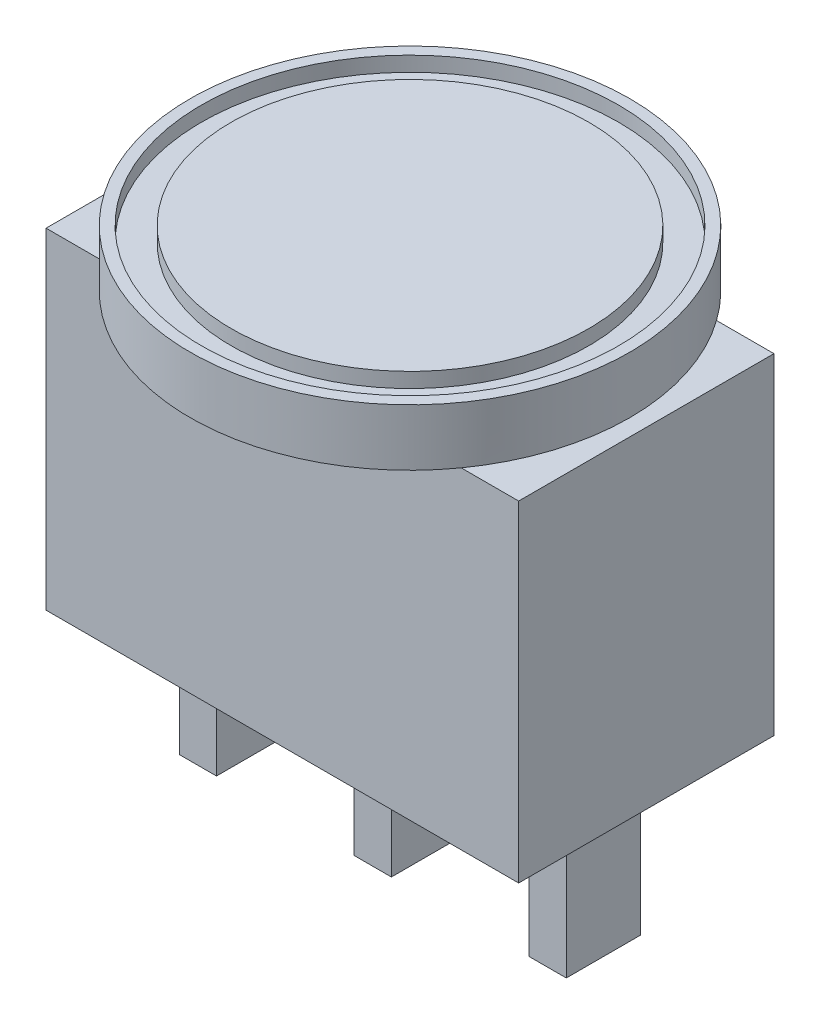
ISO-10303-21;
HEADER;
FILE_DESCRIPTION(('STEP AP214'),'2;1');
FILE_NAME('part.step','',(''),(''),'','','');
FILE_SCHEMA(('AUTOMOTIVE_DESIGN { 1 0 10303 214 1 1 1 1 }'));
ENDSEC;
DATA;
#1=APPLICATION_CONTEXT('core data for automotive mechanical design processes');
#2=APPLICATION_PROTOCOL_DEFINITION('international standard','automotive_design',2000,#1);
#3=PRODUCT_CONTEXT('',#1,'mechanical');
#4=PRODUCT('Part','Part','',(#3));
#5=PRODUCT_RELATED_PRODUCT_CATEGORY('part','',(#4));
#6=PRODUCT_DEFINITION_FORMATION('','',#4);
#7=PRODUCT_DEFINITION_CONTEXT('part definition',#1,'design');
#8=PRODUCT_DEFINITION('design','',#6,#7);
#9=PRODUCT_DEFINITION_SHAPE('','',#8);
#10=(LENGTH_UNIT() NAMED_UNIT(*) SI_UNIT(.MILLI.,.METRE.));
#11=(NAMED_UNIT(*) PLANE_ANGLE_UNIT() SI_UNIT($,.RADIAN.));
#12=(NAMED_UNIT(*) SI_UNIT($,.STERADIAN.) SOLID_ANGLE_UNIT());
#13=UNCERTAINTY_MEASURE_WITH_UNIT(LENGTH_MEASURE(1.E-05),#10,'distance_accuracy_value','');
#14=(GEOMETRIC_REPRESENTATION_CONTEXT(3) GLOBAL_UNCERTAINTY_ASSIGNED_CONTEXT((#13)) GLOBAL_UNIT_ASSIGNED_CONTEXT((#10,
#11,#12)) REPRESENTATION_CONTEXT('',''));
#15=CARTESIAN_POINT('',(0.,0.,0.));
#16=DIRECTION('',(0.,0.,1.));
#17=DIRECTION('',(1.,0.,0.));
#18=AXIS2_PLACEMENT_3D('',#15,#16,#17);
#19=CARTESIAN_POINT('',(-6.35,0.,-3.43));
#20=DIRECTION('',(0.,1.,0.));
#21=DIRECTION('',(-1.,0.,0.));
#22=AXIS2_PLACEMENT_3D('',#19,#20,#21);
#23=PLANE('',#22);
#24=DIRECTION('',(-1.,0.,0.));
#25=VECTOR('',#24,1.);
#26=CARTESIAN_POINT('',(-6.35,0.,-3.43));
#27=LINE('',#26,#25);
#28=CARTESIAN_POINT('',(6.35,0.,-3.43));
#29=VERTEX_POINT('',#28);
#30=CARTESIAN_POINT('',(4.80667504622478,0.,-3.43));
#31=VERTEX_POINT('',#30);
#32=EDGE_CURVE('E186',#29,#31,#27,.T.);
#33=ORIENTED_EDGE('',*,*,#32,.T.);
#34=CARTESIAN_POINT('',(0.,0.,0.));
#35=DIRECTION('',(0.,-1.,0.));
#36=DIRECTION('',(0.,0.,-1.));
#37=AXIS2_PLACEMENT_3D('',#34,#35,#36);
#38=CIRCLE('',#37,5.905);
#39=CARTESIAN_POINT('',(4.80667504622478,0.,3.43));
#40=VERTEX_POINT('',#39);
#41=EDGE_CURVE('E50',#31,#40,#38,.T.);
#42=ORIENTED_EDGE('',*,*,#41,.T.);
#43=DIRECTION('',(-1.,0.,0.));
#44=VECTOR('',#43,1.);
#45=CARTESIAN_POINT('',(-6.35,0.,3.43));
#46=LINE('',#45,#44);
#47=CARTESIAN_POINT('',(6.35,0.,3.43));
#48=VERTEX_POINT('',#47);
#49=EDGE_CURVE('E206',#48,#40,#46,.T.);
#50=ORIENTED_EDGE('',*,*,#49,.F.);
#51=DIRECTION('',(0.,0.,1.));
#52=VECTOR('',#51,1.);
#53=CARTESIAN_POINT('',(6.35,0.,-3.43));
#54=LINE('',#53,#52);
#55=EDGE_CURVE('E189',#29,#48,#54,.T.);
#56=ORIENTED_EDGE('',*,*,#55,.F.);
#57=EDGE_LOOP('',(#33,#42,#50,#56));
#58=FACE_BOUND('',#57,.T.);
#59=ADVANCED_FACE('F39',(#58),#23,.T.);
#60=CARTESIAN_POINT('',(-6.35,-8.89,-3.43));
#61=DIRECTION('',(0.,-1.,0.));
#62=DIRECTION('',(1.,0.,0.));
#63=AXIS2_PLACEMENT_3D('',#60,#61,#62);
#64=PLANE('',#63);
#65=DIRECTION('',(-1.,0.,0.));
#66=VECTOR('',#65,1.);
#67=CARTESIAN_POINT('',(4.2,-8.89,-1.));
#68=LINE('',#67,#66);
#69=CARTESIAN_POINT('',(5.2,-8.89,-1.));
#70=VERTEX_POINT('',#69);
#71=CARTESIAN_POINT('',(4.2,-8.89,-1.));
#72=VERTEX_POINT('',#71);
#73=EDGE_CURVE('E302',#70,#72,#68,.T.);
#74=ORIENTED_EDGE('',*,*,#73,.T.);
#75=DIRECTION('',(0.,0.,1.));
#76=VECTOR('',#75,1.);
#77=CARTESIAN_POINT('',(4.2,-8.89,-1.));
#78=LINE('',#77,#76);
#79=CARTESIAN_POINT('',(4.2,-8.89,1.));
#80=VERTEX_POINT('',#79);
#81=EDGE_CURVE('E285',#72,#80,#78,.T.);
#82=ORIENTED_EDGE('',*,*,#81,.T.);
#83=DIRECTION('',(-1.,0.,0.));
#84=VECTOR('',#83,1.);
#85=CARTESIAN_POINT('',(4.2,-8.89,1.));
#86=LINE('',#85,#84);
#87=CARTESIAN_POINT('',(5.2,-8.89,1.));
#88=VERTEX_POINT('',#87);
#89=EDGE_CURVE('E311',#88,#80,#86,.T.);
#90=ORIENTED_EDGE('',*,*,#89,.F.);
#91=DIRECTION('',(0.,0.,1.));
#92=VECTOR('',#91,1.);
#93=CARTESIAN_POINT('',(5.2,-8.89,-1.));
#94=LINE('',#93,#92);
#95=EDGE_CURVE('E284',#70,#88,#94,.T.);
#96=ORIENTED_EDGE('',*,*,#95,.F.);
#97=EDGE_LOOP('',(#74,#82,#90,#96));
#98=FACE_BOUND('',#97,.T.);
#99=DIRECTION('',(-1.,0.,0.));
#100=VECTOR('',#99,1.);
#101=CARTESIAN_POINT('',(-0.5,-8.89,-1.));
#102=LINE('',#101,#100);
#103=CARTESIAN_POINT('',(0.5,-8.89,-1.));
#104=VERTEX_POINT('',#103);
#105=CARTESIAN_POINT('',(-0.5,-8.89,-1.));
#106=VERTEX_POINT('',#105);
#107=EDGE_CURVE('E270',#104,#106,#102,.T.);
#108=ORIENTED_EDGE('',*,*,#107,.T.);
#109=DIRECTION('',(0.,0.,1.));
#110=VECTOR('',#109,1.);
#111=CARTESIAN_POINT('',(-0.5,-8.89,-1.));
#112=LINE('',#111,#110);
#113=CARTESIAN_POINT('',(-0.5,-8.89,1.));
#114=VERTEX_POINT('',#113);
#115=EDGE_CURVE('E252',#106,#114,#112,.T.);
#116=ORIENTED_EDGE('',*,*,#115,.T.);
#117=DIRECTION('',(-1.,0.,0.));
#118=VECTOR('',#117,1.);
#119=CARTESIAN_POINT('',(-0.5,-8.89,1.));
#120=LINE('',#119,#118);
#121=CARTESIAN_POINT('',(0.5,-8.89,1.));
#122=VERTEX_POINT('',#121);
#123=EDGE_CURVE('E281',#122,#114,#120,.T.);
#124=ORIENTED_EDGE('',*,*,#123,.F.);
#125=DIRECTION('',(0.,0.,1.));
#126=VECTOR('',#125,1.);
#127=CARTESIAN_POINT('',(0.5,-8.89,-1.));
#128=LINE('',#127,#126);
#129=EDGE_CURVE('E251',#104,#122,#128,.T.);
#130=ORIENTED_EDGE('',*,*,#129,.F.);
#131=EDGE_LOOP('',(#108,#116,#124,#130));
#132=FACE_BOUND('',#131,.T.);
#133=DIRECTION('',(0.,0.,1.));
#134=VECTOR('',#133,1.);
#135=CARTESIAN_POINT('',(6.35,-8.89,-3.43));
#136=LINE('',#135,#134);
#137=CARTESIAN_POINT('',(6.35,-8.89,-3.43));
#138=VERTEX_POINT('',#137);
#139=CARTESIAN_POINT('',(6.35,-8.89,3.43));
#140=VERTEX_POINT('',#139);
#141=EDGE_CURVE('E191',#138,#140,#136,.T.);
#142=ORIENTED_EDGE('',*,*,#141,.T.);
#143=DIRECTION('',(1.,0.,0.));
#144=VECTOR('',#143,1.);
#145=CARTESIAN_POINT('',(-6.35,-8.89,3.43));
#146=LINE('',#145,#144);
#147=CARTESIAN_POINT('',(-6.35,-8.89,3.43));
#148=VERTEX_POINT('',#147);
#149=EDGE_CURVE('E213',#148,#140,#146,.T.);
#150=ORIENTED_EDGE('',*,*,#149,.F.);
#151=DIRECTION('',(0.,0.,1.));
#152=VECTOR('',#151,1.);
#153=CARTESIAN_POINT('',(-6.35,-8.89,-3.43));
#154=LINE('',#153,#152);
#155=CARTESIAN_POINT('',(-6.35,-8.89,-3.43));
#156=VERTEX_POINT('',#155);
#157=EDGE_CURVE('E43',#156,#148,#154,.T.);
#158=ORIENTED_EDGE('',*,*,#157,.F.);
#159=DIRECTION('',(1.,0.,0.));
#160=VECTOR('',#159,1.);
#161=CARTESIAN_POINT('',(-6.35,-8.89,-3.43));
#162=LINE('',#161,#160);
#163=EDGE_CURVE('E198',#156,#138,#162,.T.);
#164=ORIENTED_EDGE('',*,*,#163,.T.);
#165=EDGE_LOOP('',(#142,#150,#158,#164));
#166=FACE_BOUND('',#165,.T.);
#167=DIRECTION('',(0.,0.,1.));
#168=VECTOR('',#167,1.);
#169=CARTESIAN_POINT('',(-4.2,-8.89,-1.));
#170=LINE('',#169,#168);
#171=CARTESIAN_POINT('',(-4.2,-8.89,-1.));
#172=VERTEX_POINT('',#171);
#173=CARTESIAN_POINT('',(-4.2,-8.89,1.));
#174=VERTEX_POINT('',#173);
#175=EDGE_CURVE('E225',#172,#174,#170,.T.);
#176=ORIENTED_EDGE('',*,*,#175,.F.);
#177=DIRECTION('',(-1.,0.,0.));
#178=VECTOR('',#177,1.);
#179=CARTESIAN_POINT('',(-5.2,-8.89,-1.));
#180=LINE('',#179,#178);
#181=CARTESIAN_POINT('',(-5.2,-8.89,-1.));
#182=VERTEX_POINT('',#181);
#183=EDGE_CURVE('E223',#172,#182,#180,.T.);
#184=ORIENTED_EDGE('',*,*,#183,.T.);
#185=DIRECTION('',(0.,0.,1.));
#186=VECTOR('',#185,1.);
#187=CARTESIAN_POINT('',(-5.2,-8.89,-1.));
#188=LINE('',#187,#186);
#189=CARTESIAN_POINT('',(-5.2,-8.89,1.));
#190=VERTEX_POINT('',#189);
#191=EDGE_CURVE('E219',#182,#190,#188,.T.);
#192=ORIENTED_EDGE('',*,*,#191,.T.);
#193=DIRECTION('',(-1.,0.,0.));
#194=VECTOR('',#193,1.);
#195=CARTESIAN_POINT('',(-5.2,-8.89,1.));
#196=LINE('',#195,#194);
#197=EDGE_CURVE('E239',#174,#190,#196,.T.);
#198=ORIENTED_EDGE('',*,*,#197,.F.);
#199=EDGE_LOOP('',(#176,#184,#192,#198));
#200=FACE_BOUND('',#199,.T.);
#201=ADVANCED_FACE('F343',(#98,#132,#166,#200),#64,.T.);
#202=CARTESIAN_POINT('',(-6.35,-8.89,-3.43));
#203=DIRECTION('',(-1.,0.,0.));
#204=DIRECTION('',(0.,-1.,0.));
#205=AXIS2_PLACEMENT_3D('',#202,#203,#204);
#206=PLANE('',#205);
#207=ORIENTED_EDGE('',*,*,#157,.T.);
#208=DIRECTION('',(0.,-1.,0.));
#209=VECTOR('',#208,1.);
#210=CARTESIAN_POINT('',(-6.35,-8.89,3.43));
#211=LINE('',#210,#209);
#212=CARTESIAN_POINT('',(-6.35,0.,3.43));
#213=VERTEX_POINT('',#212);
#214=EDGE_CURVE('E216',#213,#148,#211,.T.);
#215=ORIENTED_EDGE('',*,*,#214,.F.);
#216=DIRECTION('',(0.,0.,1.));
#217=VECTOR('',#216,1.);
#218=CARTESIAN_POINT('',(-6.35,0.,-3.43));
#219=LINE('',#218,#217);
#220=CARTESIAN_POINT('',(-6.35,0.,-3.43));
#221=VERTEX_POINT('',#220);
#222=EDGE_CURVE('E48',#221,#213,#219,.T.);
#223=ORIENTED_EDGE('',*,*,#222,.F.);
#224=DIRECTION('',(0.,-1.,0.));
#225=VECTOR('',#224,1.);
#226=CARTESIAN_POINT('',(-6.35,-8.89,-3.43));
#227=LINE('',#226,#225);
#228=EDGE_CURVE('E201',#221,#156,#227,.T.);
#229=ORIENTED_EDGE('',*,*,#228,.T.);
#230=EDGE_LOOP('',(#207,#215,#223,#229));
#231=FACE_BOUND('',#230,.T.);
#232=ADVANCED_FACE('F41',(#231),#206,.T.);
#233=CARTESIAN_POINT('',(-4.80667504622478,0.,3.43));
#234=VERTEX_POINT('',#233);
#235=EDGE_CURVE('E209',#234,#213,#46,.T.);
#236=ORIENTED_EDGE('',*,*,#235,.F.);
#237=CARTESIAN_POINT('',(-4.80667504622478,0.,-3.43));
#238=VERTEX_POINT('',#237);
#239=EDGE_CURVE('E11',#234,#238,#38,.T.);
#240=ORIENTED_EDGE('',*,*,#239,.T.);
#241=EDGE_CURVE('E187',#238,#221,#27,.T.);
#242=ORIENTED_EDGE('',*,*,#241,.T.);
#243=ORIENTED_EDGE('',*,*,#222,.T.);
#244=EDGE_LOOP('',(#236,#240,#242,#243));
#245=FACE_BOUND('',#244,.T.);
#246=ADVANCED_FACE('F345',(#245),#23,.T.);
#247=CARTESIAN_POINT('',(6.35,-8.89,-3.43));
#248=DIRECTION('',(1.,0.,0.));
#249=DIRECTION('',(0.,1.,0.));
#250=AXIS2_PLACEMENT_3D('',#247,#248,#249);
#251=PLANE('',#250);
#252=ORIENTED_EDGE('',*,*,#55,.T.);
#253=DIRECTION('',(0.,1.,0.));
#254=VECTOR('',#253,1.);
#255=CARTESIAN_POINT('',(6.35,-8.89,3.43));
#256=LINE('',#255,#254);
#257=EDGE_CURVE('E210',#140,#48,#256,.T.);
#258=ORIENTED_EDGE('',*,*,#257,.F.);
#259=ORIENTED_EDGE('',*,*,#141,.F.);
#260=DIRECTION('',(0.,1.,0.));
#261=VECTOR('',#260,1.);
#262=CARTESIAN_POINT('',(6.35,-8.89,-3.43));
#263=LINE('',#262,#261);
#264=EDGE_CURVE('E194',#138,#29,#263,.T.);
#265=ORIENTED_EDGE('',*,*,#264,.T.);
#266=EDGE_LOOP('',(#252,#258,#259,#265));
#267=FACE_BOUND('',#266,.T.);
#268=ADVANCED_FACE('F353',(#267),#251,.T.);
#269=CARTESIAN_POINT('',(0.,0.,-3.43));
#270=DIRECTION('',(0.,0.,-1.));
#271=DIRECTION('',(-1.,0.,0.));
#272=AXIS2_PLACEMENT_3D('',#269,#270,#271);
#273=PLANE('',#272);
#274=ORIENTED_EDGE('',*,*,#228,.F.);
#275=ORIENTED_EDGE('',*,*,#241,.F.);
#276=EDGE_CURVE('E170',#31,#238,#27,.T.);
#277=ORIENTED_EDGE('',*,*,#276,.F.);
#278=ORIENTED_EDGE('',*,*,#32,.F.);
#279=ORIENTED_EDGE('',*,*,#264,.F.);
#280=ORIENTED_EDGE('',*,*,#163,.F.);
#281=EDGE_LOOP('',(#274,#275,#277,#278,#279,#280));
#282=FACE_BOUND('',#281,.T.);
#283=ADVANCED_FACE('F184',(#282),#273,.T.);
#284=CARTESIAN_POINT('',(0.,0.,3.43));
#285=DIRECTION('',(0.,0.,-1.));
#286=DIRECTION('',(-1.,0.,0.));
#287=AXIS2_PLACEMENT_3D('',#284,#285,#286);
#288=PLANE('',#287);
#289=ORIENTED_EDGE('',*,*,#214,.T.);
#290=ORIENTED_EDGE('',*,*,#149,.T.);
#291=ORIENTED_EDGE('',*,*,#257,.T.);
#292=ORIENTED_EDGE('',*,*,#49,.T.);
#293=EDGE_CURVE('E208',#40,#234,#46,.T.);
#294=ORIENTED_EDGE('',*,*,#293,.T.);
#295=ORIENTED_EDGE('',*,*,#235,.T.);
#296=EDGE_LOOP('',(#289,#290,#291,#292,#294,#295));
#297=FACE_BOUND('',#296,.T.);
#298=ADVANCED_FACE('F363',(#297),#288,.F.);
#299=CARTESIAN_POINT('',(-5.2,-8.89,-1.));
#300=DIRECTION('',(-1.,0.,0.));
#301=DIRECTION('',(0.,0.,1.));
#302=AXIS2_PLACEMENT_3D('',#299,#300,#301);
#303=PLANE('',#302);
#304=DIRECTION('',(0.,0.,1.));
#305=VECTOR('',#304,1.);
#306=CARTESIAN_POINT('',(-5.2,-12.89,-1.));
#307=LINE('',#306,#305);
#308=CARTESIAN_POINT('',(-5.2,-12.89,-1.));
#309=VERTEX_POINT('',#308);
#310=CARTESIAN_POINT('',(-5.2,-12.89,1.));
#311=VERTEX_POINT('',#310);
#312=EDGE_CURVE('E220',#309,#311,#307,.T.);
#313=ORIENTED_EDGE('',*,*,#312,.T.);
#314=DIRECTION('',(0.,-1.,0.));
#315=VECTOR('',#314,1.);
#316=CARTESIAN_POINT('',(-5.2,-8.89,1.));
#317=LINE('',#316,#315);
#318=EDGE_CURVE('E248',#190,#311,#317,.T.);
#319=ORIENTED_EDGE('',*,*,#318,.F.);
#320=ORIENTED_EDGE('',*,*,#191,.F.);
#321=DIRECTION('',(0.,-1.,0.));
#322=VECTOR('',#321,1.);
#323=CARTESIAN_POINT('',(-5.2,-8.89,-1.));
#324=LINE('',#323,#322);
#325=EDGE_CURVE('E236',#182,#309,#324,.T.);
#326=ORIENTED_EDGE('',*,*,#325,.T.);
#327=EDGE_LOOP('',(#313,#319,#320,#326));
#328=FACE_BOUND('',#327,.T.);
#329=ADVANCED_FACE('F426',(#328),#303,.T.);
#330=CARTESIAN_POINT('',(-4.2,-8.89,-1.));
#331=DIRECTION('',(1.,0.,0.));
#332=DIRECTION('',(0.,0.,-1.));
#333=AXIS2_PLACEMENT_3D('',#330,#331,#332);
#334=PLANE('',#333);
#335=ORIENTED_EDGE('',*,*,#175,.T.);
#336=DIRECTION('',(0.,1.,0.));
#337=VECTOR('',#336,1.);
#338=CARTESIAN_POINT('',(-4.2,-8.89,1.));
#339=LINE('',#338,#337);
#340=CARTESIAN_POINT('',(-4.2,-12.89,1.));
#341=VERTEX_POINT('',#340);
#342=EDGE_CURVE('E242',#341,#174,#339,.T.);
#343=ORIENTED_EDGE('',*,*,#342,.F.);
#344=DIRECTION('',(0.,0.,1.));
#345=VECTOR('',#344,1.);
#346=CARTESIAN_POINT('',(-4.2,-12.89,-1.));
#347=LINE('',#346,#345);
#348=CARTESIAN_POINT('',(-4.2,-12.89,-1.));
#349=VERTEX_POINT('',#348);
#350=EDGE_CURVE('E222',#349,#341,#347,.T.);
#351=ORIENTED_EDGE('',*,*,#350,.F.);
#352=DIRECTION('',(0.,1.,0.));
#353=VECTOR('',#352,1.);
#354=CARTESIAN_POINT('',(-4.2,-8.89,-1.));
#355=LINE('',#354,#353);
#356=EDGE_CURVE('E230',#349,#172,#355,.T.);
#357=ORIENTED_EDGE('',*,*,#356,.T.);
#358=EDGE_LOOP('',(#335,#343,#351,#357));
#359=FACE_BOUND('',#358,.T.);
#360=ADVANCED_FACE('F423',(#359),#334,.T.);
#361=CARTESIAN_POINT('',(-5.2,-12.89,-1.));
#362=DIRECTION('',(0.,-1.,0.));
#363=DIRECTION('',(0.,0.,-1.));
#364=AXIS2_PLACEMENT_3D('',#361,#362,#363);
#365=PLANE('',#364);
#366=ORIENTED_EDGE('',*,*,#350,.T.);
#367=DIRECTION('',(1.,0.,0.));
#368=VECTOR('',#367,1.);
#369=CARTESIAN_POINT('',(-5.2,-12.89,1.));
#370=LINE('',#369,#368);
#371=EDGE_CURVE('E245',#311,#341,#370,.T.);
#372=ORIENTED_EDGE('',*,*,#371,.F.);
#373=ORIENTED_EDGE('',*,*,#312,.F.);
#374=DIRECTION('',(1.,0.,0.));
#375=VECTOR('',#374,1.);
#376=CARTESIAN_POINT('',(-5.2,-12.89,-1.));
#377=LINE('',#376,#375);
#378=EDGE_CURVE('E233',#309,#349,#377,.T.);
#379=ORIENTED_EDGE('',*,*,#378,.T.);
#380=EDGE_LOOP('',(#366,#372,#373,#379));
#381=FACE_BOUND('',#380,.T.);
#382=ADVANCED_FACE('F421',(#381),#365,.T.);
#383=CARTESIAN_POINT('',(0.,0.,-1.));
#384=DIRECTION('',(0.,0.,1.));
#385=DIRECTION('',(1.,0.,0.));
#386=AXIS2_PLACEMENT_3D('',#383,#384,#385);
#387=PLANE('',#386);
#388=ORIENTED_EDGE('',*,*,#325,.F.);
#389=ORIENTED_EDGE('',*,*,#183,.F.);
#390=ORIENTED_EDGE('',*,*,#356,.F.);
#391=ORIENTED_EDGE('',*,*,#378,.F.);
#392=EDGE_LOOP('',(#388,#389,#390,#391));
#393=FACE_BOUND('',#392,.T.);
#394=ADVANCED_FACE('F417',(#393),#387,.F.);
#395=CARTESIAN_POINT('',(0.,0.,1.));
#396=DIRECTION('',(0.,0.,1.));
#397=DIRECTION('',(1.,0.,0.));
#398=AXIS2_PLACEMENT_3D('',#395,#396,#397);
#399=PLANE('',#398);
#400=ORIENTED_EDGE('',*,*,#318,.T.);
#401=ORIENTED_EDGE('',*,*,#371,.T.);
#402=ORIENTED_EDGE('',*,*,#342,.T.);
#403=ORIENTED_EDGE('',*,*,#197,.T.);
#404=EDGE_LOOP('',(#400,#401,#402,#403));
#405=FACE_BOUND('',#404,.T.);
#406=ADVANCED_FACE('F407',(#405),#399,.T.);
#407=CARTESIAN_POINT('',(0.5,-8.89,-1.));
#408=DIRECTION('',(1.,0.,0.));
#409=DIRECTION('',(0.,1.,0.));
#410=AXIS2_PLACEMENT_3D('',#407,#408,#409);
#411=PLANE('',#410);
#412=ORIENTED_EDGE('',*,*,#129,.T.);
#413=DIRECTION('',(0.,1.,0.));
#414=VECTOR('',#413,1.);
#415=CARTESIAN_POINT('',(0.5,-8.89,1.));
#416=LINE('',#415,#414);
#417=CARTESIAN_POINT('',(0.5,-12.89,1.));
#418=VERTEX_POINT('',#417);
#419=EDGE_CURVE('E273',#418,#122,#416,.T.);
#420=ORIENTED_EDGE('',*,*,#419,.F.);
#421=DIRECTION('',(0.,0.,1.));
#422=VECTOR('',#421,1.);
#423=CARTESIAN_POINT('',(0.5,-12.89,-1.));
#424=LINE('',#423,#422);
#425=CARTESIAN_POINT('',(0.5,-12.89,-1.));
#426=VERTEX_POINT('',#425);
#427=EDGE_CURVE('E258',#426,#418,#424,.T.);
#428=ORIENTED_EDGE('',*,*,#427,.F.);
#429=DIRECTION('',(0.,1.,0.));
#430=VECTOR('',#429,1.);
#431=CARTESIAN_POINT('',(0.5,-8.89,-1.));
#432=LINE('',#431,#430);
#433=EDGE_CURVE('E256',#426,#104,#432,.T.);
#434=ORIENTED_EDGE('',*,*,#433,.T.);
#435=EDGE_LOOP('',(#412,#420,#428,#434));
#436=FACE_BOUND('',#435,.T.);
#437=ADVANCED_FACE('F403',(#436),#411,.T.);
#438=CARTESIAN_POINT('',(-0.5,-12.89,-1.));
#439=DIRECTION('',(0.,-1.,0.));
#440=DIRECTION('',(0.,0.,-1.));
#441=AXIS2_PLACEMENT_3D('',#438,#439,#440);
#442=PLANE('',#441);
#443=ORIENTED_EDGE('',*,*,#427,.T.);
#444=DIRECTION('',(1.,0.,0.));
#445=VECTOR('',#444,1.);
#446=CARTESIAN_POINT('',(-0.5,-12.89,1.));
#447=LINE('',#446,#445);
#448=CARTESIAN_POINT('',(-0.5,-12.89,1.));
#449=VERTEX_POINT('',#448);
#450=EDGE_CURVE('E275',#449,#418,#447,.T.);
#451=ORIENTED_EDGE('',*,*,#450,.F.);
#452=DIRECTION('',(0.,0.,1.));
#453=VECTOR('',#452,1.);
#454=CARTESIAN_POINT('',(-0.5,-12.89,-1.));
#455=LINE('',#454,#453);
#456=CARTESIAN_POINT('',(-0.5,-12.89,-1.));
#457=VERTEX_POINT('',#456);
#458=EDGE_CURVE('E255',#457,#449,#455,.T.);
#459=ORIENTED_EDGE('',*,*,#458,.F.);
#460=DIRECTION('',(1.,0.,0.));
#461=VECTOR('',#460,1.);
#462=CARTESIAN_POINT('',(-0.5,-12.89,-1.));
#463=LINE('',#462,#461);
#464=EDGE_CURVE('E264',#457,#426,#463,.T.);
#465=ORIENTED_EDGE('',*,*,#464,.T.);
#466=EDGE_LOOP('',(#443,#451,#459,#465));
#467=FACE_BOUND('',#466,.T.);
#468=ADVANCED_FACE('F406',(#467),#442,.T.);
#469=CARTESIAN_POINT('',(-0.5,-8.89,-1.));
#470=DIRECTION('',(-1.,0.,0.));
#471=DIRECTION('',(0.,-1.,0.));
#472=AXIS2_PLACEMENT_3D('',#469,#470,#471);
#473=PLANE('',#472);
#474=ORIENTED_EDGE('',*,*,#458,.T.);
#475=DIRECTION('',(0.,-1.,0.));
#476=VECTOR('',#475,1.);
#477=CARTESIAN_POINT('',(-0.5,-8.89,1.));
#478=LINE('',#477,#476);
#479=EDGE_CURVE('E278',#114,#449,#478,.T.);
#480=ORIENTED_EDGE('',*,*,#479,.F.);
#481=ORIENTED_EDGE('',*,*,#115,.F.);
#482=DIRECTION('',(0.,-1.,0.));
#483=VECTOR('',#482,1.);
#484=CARTESIAN_POINT('',(-0.5,-8.89,-1.));
#485=LINE('',#484,#483);
#486=EDGE_CURVE('E267',#106,#457,#485,.T.);
#487=ORIENTED_EDGE('',*,*,#486,.T.);
#488=EDGE_LOOP('',(#474,#480,#481,#487));
#489=FACE_BOUND('',#488,.T.);
#490=ADVANCED_FACE('F401',(#489),#473,.T.);
#491=CARTESIAN_POINT('',(0.,0.,-1.));
#492=DIRECTION('',(0.,0.,-1.));
#493=DIRECTION('',(-1.,0.,0.));
#494=AXIS2_PLACEMENT_3D('',#491,#492,#493);
#495=PLANE('',#494);
#496=ORIENTED_EDGE('',*,*,#107,.F.);
#497=ORIENTED_EDGE('',*,*,#433,.F.);
#498=ORIENTED_EDGE('',*,*,#464,.F.);
#499=ORIENTED_EDGE('',*,*,#486,.F.);
#500=EDGE_LOOP('',(#496,#497,#498,#499));
#501=FACE_BOUND('',#500,.T.);
#502=ADVANCED_FACE('F397',(#501),#495,.T.);
#503=CARTESIAN_POINT('',(0.,0.,1.));
#504=DIRECTION('',(0.,0.,-1.));
#505=DIRECTION('',(-1.,0.,0.));
#506=AXIS2_PLACEMENT_3D('',#503,#504,#505);
#507=PLANE('',#506);
#508=ORIENTED_EDGE('',*,*,#123,.T.);
#509=ORIENTED_EDGE('',*,*,#479,.T.);
#510=ORIENTED_EDGE('',*,*,#450,.T.);
#511=ORIENTED_EDGE('',*,*,#419,.T.);
#512=EDGE_LOOP('',(#508,#509,#510,#511));
#513=FACE_BOUND('',#512,.T.);
#514=ADVANCED_FACE('F387',(#513),#507,.F.);
#515=CARTESIAN_POINT('',(5.2,-8.89,-1.));
#516=DIRECTION('',(1.,0.,0.));
#517=DIRECTION('',(0.,0.,-1.));
#518=AXIS2_PLACEMENT_3D('',#515,#516,#517);
#519=PLANE('',#518);
#520=ORIENTED_EDGE('',*,*,#95,.T.);
#521=DIRECTION('',(0.,1.,0.));
#522=VECTOR('',#521,1.);
#523=CARTESIAN_POINT('',(5.2,-8.89,1.));
#524=LINE('',#523,#522);
#525=CARTESIAN_POINT('',(5.2,-12.89,1.));
#526=VERTEX_POINT('',#525);
#527=EDGE_CURVE('E66',#526,#88,#524,.T.);
#528=ORIENTED_EDGE('',*,*,#527,.F.);
#529=DIRECTION('',(0.,0.,1.));
#530=VECTOR('',#529,1.);
#531=CARTESIAN_POINT('',(5.2,-12.89,-1.));
#532=LINE('',#531,#530);
#533=CARTESIAN_POINT('',(5.2,-12.89,-1.));
#534=VERTEX_POINT('',#533);
#535=EDGE_CURVE('E291',#534,#526,#532,.T.);
#536=ORIENTED_EDGE('',*,*,#535,.F.);
#537=DIRECTION('',(0.,1.,0.));
#538=VECTOR('',#537,1.);
#539=CARTESIAN_POINT('',(5.2,-8.89,-1.));
#540=LINE('',#539,#538);
#541=EDGE_CURVE('E289',#534,#70,#540,.T.);
#542=ORIENTED_EDGE('',*,*,#541,.T.);
#543=EDGE_LOOP('',(#520,#528,#536,#542));
#544=FACE_BOUND('',#543,.T.);
#545=ADVANCED_FACE('F383',(#544),#519,.T.);
#546=CARTESIAN_POINT('',(4.2,-12.89,-1.));
#547=DIRECTION('',(0.,-1.,0.));
#548=DIRECTION('',(0.,0.,-1.));
#549=AXIS2_PLACEMENT_3D('',#546,#547,#548);
#550=PLANE('',#549);
#551=ORIENTED_EDGE('',*,*,#535,.T.);
#552=DIRECTION('',(1.,0.,0.));
#553=VECTOR('',#552,1.);
#554=CARTESIAN_POINT('',(4.2,-12.89,1.));
#555=LINE('',#554,#553);
#556=CARTESIAN_POINT('',(4.2,-12.89,1.));
#557=VERTEX_POINT('',#556);
#558=EDGE_CURVE('E306',#557,#526,#555,.T.);
#559=ORIENTED_EDGE('',*,*,#558,.F.);
#560=DIRECTION('',(0.,0.,1.));
#561=VECTOR('',#560,1.);
#562=CARTESIAN_POINT('',(4.2,-12.89,-1.));
#563=LINE('',#562,#561);
#564=CARTESIAN_POINT('',(4.2,-12.89,-1.));
#565=VERTEX_POINT('',#564);
#566=EDGE_CURVE('E288',#565,#557,#563,.T.);
#567=ORIENTED_EDGE('',*,*,#566,.F.);
#568=DIRECTION('',(1.,0.,0.));
#569=VECTOR('',#568,1.);
#570=CARTESIAN_POINT('',(4.2,-12.89,-1.));
#571=LINE('',#570,#569);
#572=EDGE_CURVE('E296',#565,#534,#571,.T.);
#573=ORIENTED_EDGE('',*,*,#572,.T.);
#574=EDGE_LOOP('',(#551,#559,#567,#573));
#575=FACE_BOUND('',#574,.T.);
#576=ADVANCED_FACE('F386',(#575),#550,.T.);
#577=CARTESIAN_POINT('',(4.2,-8.89,-1.));
#578=DIRECTION('',(-1.,0.,0.));
#579=DIRECTION('',(0.,0.,1.));
#580=AXIS2_PLACEMENT_3D('',#577,#578,#579);
#581=PLANE('',#580);
#582=ORIENTED_EDGE('',*,*,#566,.T.);
#583=DIRECTION('',(0.,-1.,0.));
#584=VECTOR('',#583,1.);
#585=CARTESIAN_POINT('',(4.2,-8.89,1.));
#586=LINE('',#585,#584);
#587=EDGE_CURVE('E308',#80,#557,#586,.T.);
#588=ORIENTED_EDGE('',*,*,#587,.F.);
#589=ORIENTED_EDGE('',*,*,#81,.F.);
#590=DIRECTION('',(0.,-1.,0.));
#591=VECTOR('',#590,1.);
#592=CARTESIAN_POINT('',(4.2,-8.89,-1.));
#593=LINE('',#592,#591);
#594=EDGE_CURVE('E299',#72,#565,#593,.T.);
#595=ORIENTED_EDGE('',*,*,#594,.T.);
#596=EDGE_LOOP('',(#582,#588,#589,#595));
#597=FACE_BOUND('',#596,.T.);
#598=ADVANCED_FACE('F381',(#597),#581,.T.);
#599=CARTESIAN_POINT('',(0.,0.,-1.));
#600=DIRECTION('',(0.,0.,-1.));
#601=DIRECTION('',(-1.,0.,0.));
#602=AXIS2_PLACEMENT_3D('',#599,#600,#601);
#603=PLANE('',#602);
#604=ORIENTED_EDGE('',*,*,#73,.F.);
#605=ORIENTED_EDGE('',*,*,#541,.F.);
#606=ORIENTED_EDGE('',*,*,#572,.F.);
#607=ORIENTED_EDGE('',*,*,#594,.F.);
#608=EDGE_LOOP('',(#604,#605,#606,#607));
#609=FACE_BOUND('',#608,.T.);
#610=ADVANCED_FACE('F374',(#609),#603,.T.);
#611=CARTESIAN_POINT('',(0.,0.,1.));
#612=DIRECTION('',(0.,0.,-1.));
#613=DIRECTION('',(-1.,0.,0.));
#614=AXIS2_PLACEMENT_3D('',#611,#612,#613);
#615=PLANE('',#614);
#616=ORIENTED_EDGE('',*,*,#89,.T.);
#617=ORIENTED_EDGE('',*,*,#587,.T.);
#618=ORIENTED_EDGE('',*,*,#558,.T.);
#619=ORIENTED_EDGE('',*,*,#527,.T.);
#620=EDGE_LOOP('',(#616,#617,#618,#619));
#621=FACE_BOUND('',#620,.T.);
#622=ADVANCED_FACE('F367',(#621),#615,.F.);
#623=CARTESIAN_POINT('',(5.905,0.,0.));
#624=DIRECTION('',(0.,-1.,0.));
#625=DIRECTION('',(0.,0.,-1.));
#626=AXIS2_PLACEMENT_3D('',#623,#624,#625);
#627=PLANE('',#626);
#628=ORIENTED_EDGE('',*,*,#293,.F.);
#629=EDGE_CURVE('E51',#40,#234,#38,.T.);
#630=ORIENTED_EDGE('',*,*,#629,.T.);
#631=EDGE_LOOP('',(#628,#630));
#632=FACE_BOUND('',#631,.T.);
#633=ADVANCED_FACE('F365',(#632),#627,.T.);
#634=EDGE_CURVE('E58',#238,#31,#38,.T.);
#635=ORIENTED_EDGE('',*,*,#634,.T.);
#636=ORIENTED_EDGE('',*,*,#276,.T.);
#637=EDGE_LOOP('',(#635,#636));
#638=FACE_BOUND('',#637,.T.);
#639=ADVANCED_FACE('F168',(#638),#627,.T.);
#640=CARTESIAN_POINT('',(0.,1.524,0.));
#641=DIRECTION('',(0.,1.,0.));
#642=DIRECTION('',(0.,0.,1.));
#643=AXIS2_PLACEMENT_3D('',#640,#641,#642);
#644=PLANE('',#643);
#645=CARTESIAN_POINT('',(0.,1.524,0.));
#646=DIRECTION('',(0.,-1.,0.));
#647=DIRECTION('',(0.,0.,-1.));
#648=AXIS2_PLACEMENT_3D('',#645,#646,#647);
#649=CIRCLE('',#648,4.805);
#650=CARTESIAN_POINT('',(0.,1.524,-4.805));
#651=VERTEX_POINT('',#650);
#652=EDGE_CURVE('E313',#651,#651,#649,.T.);
#653=ORIENTED_EDGE('',*,*,#652,.F.);
#654=EDGE_LOOP('',(#653));
#655=FACE_BOUND('',#654,.T.);
#656=ADVANCED_FACE('F373',(#655),#644,.T.);
#657=CARTESIAN_POINT('',(0.,0.,0.));
#658=DIRECTION('',(0.,-1.,0.));
#659=DIRECTION('',(0.,0.,-1.));
#660=AXIS2_PLACEMENT_3D('',#657,#658,#659);
#661=CYLINDRICAL_SURFACE('',#660,4.805);
#662=ORIENTED_EDGE('',*,*,#652,.T.);
#663=EDGE_LOOP('',(#662));
#664=FACE_BOUND('',#663,.T.);
#665=CARTESIAN_POINT('',(0.,1.124,0.));
#666=DIRECTION('',(0.,-1.,0.));
#667=DIRECTION('',(0.,0.,-1.));
#668=AXIS2_PLACEMENT_3D('',#665,#666,#667);
#669=CIRCLE('',#668,4.805);
#670=CARTESIAN_POINT('',(0.,1.124,-4.805));
#671=VERTEX_POINT('',#670);
#672=EDGE_CURVE('E316',#671,#671,#669,.T.);
#673=ORIENTED_EDGE('',*,*,#672,.F.);
#674=EDGE_LOOP('',(#673));
#675=FACE_BOUND('',#674,.T.);
#676=ADVANCED_FACE('F504',(#664,#675),#661,.T.);
#677=CARTESIAN_POINT('',(4.805,1.124,0.));
#678=DIRECTION('',(0.,1.,0.));
#679=DIRECTION('',(0.,0.,1.));
#680=AXIS2_PLACEMENT_3D('',#677,#678,#679);
#681=PLANE('',#680);
#682=ORIENTED_EDGE('',*,*,#672,.T.);
#683=EDGE_LOOP('',(#682));
#684=FACE_BOUND('',#683,.T.);
#685=CARTESIAN_POINT('',(0.,1.124,0.));
#686=DIRECTION('',(0.,-1.,0.));
#687=DIRECTION('',(0.,0.,-1.));
#688=AXIS2_PLACEMENT_3D('',#685,#686,#687);
#689=CIRCLE('',#688,5.605);
#690=CARTESIAN_POINT('',(0.,1.124,-5.605));
#691=VERTEX_POINT('',#690);
#692=EDGE_CURVE('E319',#691,#691,#689,.T.);
#693=ORIENTED_EDGE('',*,*,#692,.F.);
#694=EDGE_LOOP('',(#693));
#695=FACE_BOUND('',#694,.T.);
#696=ADVANCED_FACE('F339',(#684,#695),#681,.T.);
#697=CARTESIAN_POINT('',(0.,0.,0.));
#698=DIRECTION('',(0.,-1.,0.));
#699=DIRECTION('',(0.,0.,-1.));
#700=AXIS2_PLACEMENT_3D('',#697,#698,#699);
#701=CYLINDRICAL_SURFACE('',#700,5.605);
#702=ORIENTED_EDGE('',*,*,#692,.T.);
#703=EDGE_LOOP('',(#702));
#704=FACE_BOUND('',#703,.T.);
#705=CARTESIAN_POINT('',(0.,1.524,0.));
#706=DIRECTION('',(0.,-1.,0.));
#707=DIRECTION('',(0.,0.,-1.));
#708=AXIS2_PLACEMENT_3D('',#705,#706,#707);
#709=CIRCLE('',#708,5.605);
#710=CARTESIAN_POINT('',(0.,1.524,-5.605));
#711=VERTEX_POINT('',#710);
#712=EDGE_CURVE('E322',#711,#711,#709,.T.);
#713=ORIENTED_EDGE('',*,*,#712,.F.);
#714=EDGE_LOOP('',(#713));
#715=FACE_BOUND('',#714,.T.);
#716=ADVANCED_FACE('F331',(#704,#715),#701,.F.);
#717=CARTESIAN_POINT('',(5.605,1.524,0.));
#718=DIRECTION('',(0.,1.,0.));
#719=DIRECTION('',(0.,0.,1.));
#720=AXIS2_PLACEMENT_3D('',#717,#718,#719);
#721=PLANE('',#720);
#722=ORIENTED_EDGE('',*,*,#712,.T.);
#723=EDGE_LOOP('',(#722));
#724=FACE_BOUND('',#723,.T.);
#725=CARTESIAN_POINT('',(0.,1.524,0.));
#726=DIRECTION('',(0.,-1.,0.));
#727=DIRECTION('',(0.,0.,-1.));
#728=AXIS2_PLACEMENT_3D('',#725,#726,#727);
#729=CIRCLE('',#728,5.905);
#730=CARTESIAN_POINT('',(0.,1.524,-5.905));
#731=VERTEX_POINT('',#730);
#732=EDGE_CURVE('E179',#731,#731,#729,.T.);
#733=ORIENTED_EDGE('',*,*,#732,.F.);
#734=EDGE_LOOP('',(#733));
#735=FACE_BOUND('',#734,.T.);
#736=ADVANCED_FACE('F329',(#724,#735),#721,.T.);
#737=CARTESIAN_POINT('',(0.,0.,0.));
#738=DIRECTION('',(0.,-1.,0.));
#739=DIRECTION('',(0.,0.,-1.));
#740=AXIS2_PLACEMENT_3D('',#737,#738,#739);
#741=CYLINDRICAL_SURFACE('',#740,5.905);
#742=ORIENTED_EDGE('',*,*,#732,.T.);
#743=EDGE_LOOP('',(#742));
#744=FACE_BOUND('',#743,.T.);
#745=ORIENTED_EDGE('',*,*,#41,.F.);
#746=ORIENTED_EDGE('',*,*,#634,.F.);
#747=ORIENTED_EDGE('',*,*,#239,.F.);
#748=ORIENTED_EDGE('',*,*,#629,.F.);
#749=EDGE_LOOP('',(#745,#746,#747,#748));
#750=FACE_BOUND('',#749,.T.);
#751=ADVANCED_FACE('F173',(#744,#750),#741,.T.);
#752=CLOSED_SHELL('',(#59,#201,#232,#246,#268,#283,#298,#329,#360,#382,#394,#406,#437,#468,#490,
#502,#514,#545,#576,#598,#610,#622,#633,#639,#656,#676,#696,#716,#736,#751));
#753=MANIFOLD_SOLID_BREP('B2',#752);
#754=ADVANCED_BREP_SHAPE_REPRESENTATION('',(#18,#753),#14);
#755=SHAPE_DEFINITION_REPRESENTATION(#9,#754);
ENDSEC;
END-ISO-10303-21;
